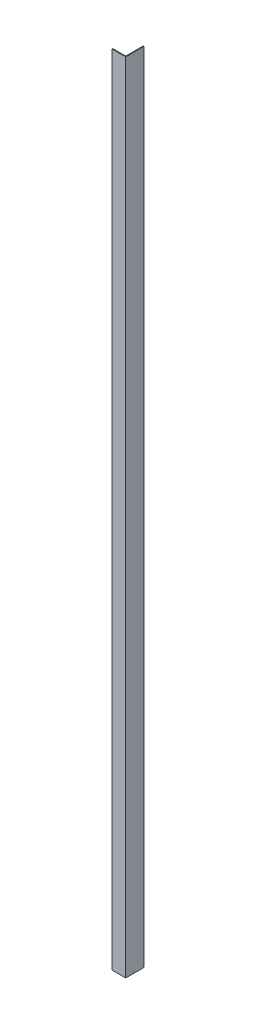
ISO-10303-21;
HEADER;
FILE_DESCRIPTION(('STEP AP214'),'2;1');
FILE_NAME('part.step','',(''),(''),'','','');
FILE_SCHEMA(('AUTOMOTIVE_DESIGN { 1 0 10303 214 1 1 1 1 }'));
ENDSEC;
DATA;
#1=APPLICATION_CONTEXT('core data for automotive mechanical design processes');
#2=APPLICATION_PROTOCOL_DEFINITION('international standard','automotive_design',2000,#1);
#3=PRODUCT_CONTEXT('',#1,'mechanical');
#4=PRODUCT('Part','Part','',(#3));
#5=PRODUCT_RELATED_PRODUCT_CATEGORY('part','',(#4));
#6=PRODUCT_DEFINITION_FORMATION('','',#4);
#7=PRODUCT_DEFINITION_CONTEXT('part definition',#1,'design');
#8=PRODUCT_DEFINITION('design','',#6,#7);
#9=PRODUCT_DEFINITION_SHAPE('','',#8);
#10=(LENGTH_UNIT() NAMED_UNIT(*) SI_UNIT(.MILLI.,.METRE.));
#11=(NAMED_UNIT(*) PLANE_ANGLE_UNIT() SI_UNIT($,.RADIAN.));
#12=(NAMED_UNIT(*) SI_UNIT($,.STERADIAN.) SOLID_ANGLE_UNIT());
#13=UNCERTAINTY_MEASURE_WITH_UNIT(LENGTH_MEASURE(1.E-05),#10,'distance_accuracy_value','');
#14=(GEOMETRIC_REPRESENTATION_CONTEXT(3) GLOBAL_UNCERTAINTY_ASSIGNED_CONTEXT((#13)) GLOBAL_UNIT_ASSIGNED_CONTEXT((#10,
#11,#12)) REPRESENTATION_CONTEXT('',''));
#15=CARTESIAN_POINT('',(0.,0.,0.));
#16=DIRECTION('',(0.,0.,1.));
#17=DIRECTION('',(1.,0.,0.));
#18=AXIS2_PLACEMENT_3D('',#15,#16,#17);
#19=CARTESIAN_POINT('',(30.,1970.,40.));
#20=DIRECTION('',(0.,0.,-1.));
#21=DIRECTION('',(-1.,0.,0.));
#22=AXIS2_PLACEMENT_3D('',#19,#20,#21);
#23=PLANE('',#22);
#24=DIRECTION('',(1.,0.,0.));
#25=VECTOR('',#24,1.);
#26=CARTESIAN_POINT('',(30.,200.,40.));
#27=LINE('',#26,#25);
#28=CARTESIAN_POINT('',(0.,200.,40.));
#29=VERTEX_POINT('',#28);
#30=CARTESIAN_POINT('',(30.,200.,40.));
#31=VERTEX_POINT('',#30);
#32=EDGE_CURVE('E123',#29,#31,#27,.T.);
#33=ORIENTED_EDGE('',*,*,#32,.T.);
#34=DIRECTION('',(0.,-1.,0.));
#35=VECTOR('',#34,1.);
#36=CARTESIAN_POINT('',(30.,1970.,40.));
#37=LINE('',#36,#35);
#38=CARTESIAN_POINT('',(30.,1970.,40.));
#39=VERTEX_POINT('',#38);
#40=EDGE_CURVE('E11',#39,#31,#37,.T.);
#41=ORIENTED_EDGE('',*,*,#40,.F.);
#42=DIRECTION('',(1.,0.,0.));
#43=VECTOR('',#42,1.);
#44=CARTESIAN_POINT('',(30.,1970.,40.));
#45=LINE('',#44,#43);
#46=CARTESIAN_POINT('',(0.,1970.,40.));
#47=VERTEX_POINT('',#46);
#48=EDGE_CURVE('E133',#47,#39,#45,.T.);
#49=ORIENTED_EDGE('',*,*,#48,.F.);
#50=DIRECTION('',(0.,-1.,0.));
#51=VECTOR('',#50,1.);
#52=CARTESIAN_POINT('',(0.,1970.,40.));
#53=LINE('',#52,#51);
#54=EDGE_CURVE('E119',#47,#29,#53,.T.);
#55=ORIENTED_EDGE('',*,*,#54,.T.);
#56=EDGE_LOOP('',(#33,#41,#49,#55));
#57=FACE_BOUND('',#56,.T.);
#58=ADVANCED_FACE('F39',(#57),#23,.F.);
#59=CARTESIAN_POINT('',(30.,1970.,0.));
#60=DIRECTION('',(-1.,0.,0.));
#61=DIRECTION('',(0.,0.,1.));
#62=AXIS2_PLACEMENT_3D('',#59,#60,#61);
#63=PLANE('',#62);
#64=DIRECTION('',(0.,0.,-1.));
#65=VECTOR('',#64,1.);
#66=CARTESIAN_POINT('',(30.,200.,0.));
#67=LINE('',#66,#65);
#68=CARTESIAN_POINT('',(30.,200.,0.));
#69=VERTEX_POINT('',#68);
#70=EDGE_CURVE('E126',#31,#69,#67,.T.);
#71=ORIENTED_EDGE('',*,*,#70,.T.);
#72=DIRECTION('',(0.,-1.,0.));
#73=VECTOR('',#72,1.);
#74=CARTESIAN_POINT('',(30.,1970.,0.));
#75=LINE('',#74,#73);
#76=CARTESIAN_POINT('',(30.,1970.,0.));
#77=VERTEX_POINT('',#76);
#78=EDGE_CURVE('E47',#77,#69,#75,.T.);
#79=ORIENTED_EDGE('',*,*,#78,.F.);
#80=DIRECTION('',(0.,0.,-1.));
#81=VECTOR('',#80,1.);
#82=CARTESIAN_POINT('',(30.,1970.,0.));
#83=LINE('',#82,#81);
#84=EDGE_CURVE('E92',#39,#77,#83,.T.);
#85=ORIENTED_EDGE('',*,*,#84,.F.);
#86=ORIENTED_EDGE('',*,*,#40,.T.);
#87=EDGE_LOOP('',(#71,#79,#85,#86));
#88=FACE_BOUND('',#87,.T.);
#89=ADVANCED_FACE('F157',(#88),#63,.F.);
#90=CARTESIAN_POINT('',(28.5,1970.,0.));
#91=DIRECTION('',(0.,0.,1.));
#92=DIRECTION('',(1.,0.,0.));
#93=AXIS2_PLACEMENT_3D('',#90,#91,#92);
#94=PLANE('',#93);
#95=DIRECTION('',(-1.,0.,0.));
#96=VECTOR('',#95,1.);
#97=CARTESIAN_POINT('',(28.5,200.,0.));
#98=LINE('',#97,#96);
#99=CARTESIAN_POINT('',(28.5,200.,0.));
#100=VERTEX_POINT('',#99);
#101=EDGE_CURVE('E128',#69,#100,#98,.T.);
#102=ORIENTED_EDGE('',*,*,#101,.T.);
#103=DIRECTION('',(0.,-1.,0.));
#104=VECTOR('',#103,1.);
#105=CARTESIAN_POINT('',(28.5,1970.,0.));
#106=LINE('',#105,#104);
#107=CARTESIAN_POINT('',(28.5,1970.,0.));
#108=VERTEX_POINT('',#107);
#109=EDGE_CURVE('E114',#108,#100,#106,.T.);
#110=ORIENTED_EDGE('',*,*,#109,.F.);
#111=DIRECTION('',(-1.,0.,0.));
#112=VECTOR('',#111,1.);
#113=CARTESIAN_POINT('',(28.5,1970.,0.));
#114=LINE('',#113,#112);
#115=EDGE_CURVE('E105',#77,#108,#114,.T.);
#116=ORIENTED_EDGE('',*,*,#115,.F.);
#117=ORIENTED_EDGE('',*,*,#78,.T.);
#118=EDGE_LOOP('',(#102,#110,#116,#117));
#119=FACE_BOUND('',#118,.T.);
#120=ADVANCED_FACE('F139',(#119),#94,.F.);
#121=CARTESIAN_POINT('',(28.5,1970.,38.5));
#122=DIRECTION('',(1.,0.,0.));
#123=DIRECTION('',(0.,0.,-1.));
#124=AXIS2_PLACEMENT_3D('',#121,#122,#123);
#125=PLANE('',#124);
#126=DIRECTION('',(0.,0.,1.));
#127=VECTOR('',#126,1.);
#128=CARTESIAN_POINT('',(28.5,200.,38.5));
#129=LINE('',#128,#127);
#130=CARTESIAN_POINT('',(28.5,200.,38.5));
#131=VERTEX_POINT('',#130);
#132=EDGE_CURVE('E113',#100,#131,#129,.T.);
#133=ORIENTED_EDGE('',*,*,#132,.T.);
#134=DIRECTION('',(0.,-1.,0.));
#135=VECTOR('',#134,1.);
#136=CARTESIAN_POINT('',(28.5,1970.,38.5));
#137=LINE('',#136,#135);
#138=CARTESIAN_POINT('',(28.5,1970.,38.5));
#139=VERTEX_POINT('',#138);
#140=EDGE_CURVE('E110',#139,#131,#137,.T.);
#141=ORIENTED_EDGE('',*,*,#140,.F.);
#142=DIRECTION('',(0.,0.,1.));
#143=VECTOR('',#142,1.);
#144=CARTESIAN_POINT('',(28.5,1970.,38.5));
#145=LINE('',#144,#143);
#146=EDGE_CURVE('E99',#108,#139,#145,.T.);
#147=ORIENTED_EDGE('',*,*,#146,.F.);
#148=ORIENTED_EDGE('',*,*,#109,.T.);
#149=EDGE_LOOP('',(#133,#141,#147,#148));
#150=FACE_BOUND('',#149,.T.);
#151=ADVANCED_FACE('F111',(#150),#125,.F.);
#152=CARTESIAN_POINT('',(0.,1970.,38.5));
#153=DIRECTION('',(0.,0.,1.));
#154=DIRECTION('',(1.,0.,0.));
#155=AXIS2_PLACEMENT_3D('',#152,#153,#154);
#156=PLANE('',#155);
#157=DIRECTION('',(-1.,0.,0.));
#158=VECTOR('',#157,1.);
#159=CARTESIAN_POINT('',(0.,200.,38.5));
#160=LINE('',#159,#158);
#161=CARTESIAN_POINT('',(0.,200.,38.5));
#162=VERTEX_POINT('',#161);
#163=EDGE_CURVE('E78',#131,#162,#160,.T.);
#164=ORIENTED_EDGE('',*,*,#163,.T.);
#165=DIRECTION('',(0.,-1.,0.));
#166=VECTOR('',#165,1.);
#167=CARTESIAN_POINT('',(0.,1970.,38.5));
#168=LINE('',#167,#166);
#169=CARTESIAN_POINT('',(0.,1970.,38.5));
#170=VERTEX_POINT('',#169);
#171=EDGE_CURVE('E115',#170,#162,#168,.T.);
#172=ORIENTED_EDGE('',*,*,#171,.F.);
#173=DIRECTION('',(-1.,0.,0.));
#174=VECTOR('',#173,1.);
#175=CARTESIAN_POINT('',(0.,1970.,38.5));
#176=LINE('',#175,#174);
#177=EDGE_CURVE('E103',#139,#170,#176,.T.);
#178=ORIENTED_EDGE('',*,*,#177,.F.);
#179=ORIENTED_EDGE('',*,*,#140,.T.);
#180=EDGE_LOOP('',(#164,#172,#178,#179));
#181=FACE_BOUND('',#180,.T.);
#182=ADVANCED_FACE('F117',(#181),#156,.F.);
#183=CARTESIAN_POINT('',(0.,1970.,40.));
#184=DIRECTION('',(1.,0.,0.));
#185=DIRECTION('',(0.,0.,-1.));
#186=AXIS2_PLACEMENT_3D('',#183,#184,#185);
#187=PLANE('',#186);
#188=DIRECTION('',(0.,0.,1.));
#189=VECTOR('',#188,1.);
#190=CARTESIAN_POINT('',(0.,200.,40.));
#191=LINE('',#190,#189);
#192=EDGE_CURVE('E84',#162,#29,#191,.T.);
#193=ORIENTED_EDGE('',*,*,#192,.T.);
#194=ORIENTED_EDGE('',*,*,#54,.F.);
#195=DIRECTION('',(0.,0.,1.));
#196=VECTOR('',#195,1.);
#197=CARTESIAN_POINT('',(0.,1970.,40.));
#198=LINE('',#197,#196);
#199=EDGE_CURVE('E55',#170,#47,#198,.T.);
#200=ORIENTED_EDGE('',*,*,#199,.F.);
#201=ORIENTED_EDGE('',*,*,#171,.T.);
#202=EDGE_LOOP('',(#193,#194,#200,#201));
#203=FACE_BOUND('',#202,.T.);
#204=ADVANCED_FACE('F146',(#203),#187,.F.);
#205=CARTESIAN_POINT('',(0.,1970.,0.));
#206=DIRECTION('',(0.,-1.,0.));
#207=DIRECTION('',(0.,0.,-1.));
#208=AXIS2_PLACEMENT_3D('',#205,#206,#207);
#209=PLANE('',#208);
#210=ORIENTED_EDGE('',*,*,#48,.T.);
#211=ORIENTED_EDGE('',*,*,#84,.T.);
#212=ORIENTED_EDGE('',*,*,#115,.T.);
#213=ORIENTED_EDGE('',*,*,#146,.T.);
#214=ORIENTED_EDGE('',*,*,#177,.T.);
#215=ORIENTED_EDGE('',*,*,#199,.T.);
#216=EDGE_LOOP('',(#210,#211,#212,#213,#214,#215));
#217=FACE_BOUND('',#216,.T.);
#218=ADVANCED_FACE('F101',(#217),#209,.F.);
#219=CARTESIAN_POINT('',(0.,200.,0.));
#220=DIRECTION('',(0.,-1.,0.));
#221=DIRECTION('',(0.,0.,-1.));
#222=AXIS2_PLACEMENT_3D('',#219,#220,#221);
#223=PLANE('',#222);
#224=ORIENTED_EDGE('',*,*,#32,.F.);
#225=ORIENTED_EDGE('',*,*,#192,.F.);
#226=ORIENTED_EDGE('',*,*,#163,.F.);
#227=ORIENTED_EDGE('',*,*,#132,.F.);
#228=ORIENTED_EDGE('',*,*,#101,.F.);
#229=ORIENTED_EDGE('',*,*,#70,.F.);
#230=EDGE_LOOP('',(#224,#225,#226,#227,#228,#229));
#231=FACE_BOUND('',#230,.T.);
#232=ADVANCED_FACE('F142',(#231),#223,.T.);
#233=CLOSED_SHELL('',(#58,#89,#120,#151,#182,#204,#218,#232));
#234=MANIFOLD_SOLID_BREP('B2',#233);
#235=ADVANCED_BREP_SHAPE_REPRESENTATION('',(#18,#234),#14);
#236=SHAPE_DEFINITION_REPRESENTATION(#9,#235);
ENDSEC;
END-ISO-10303-21;
